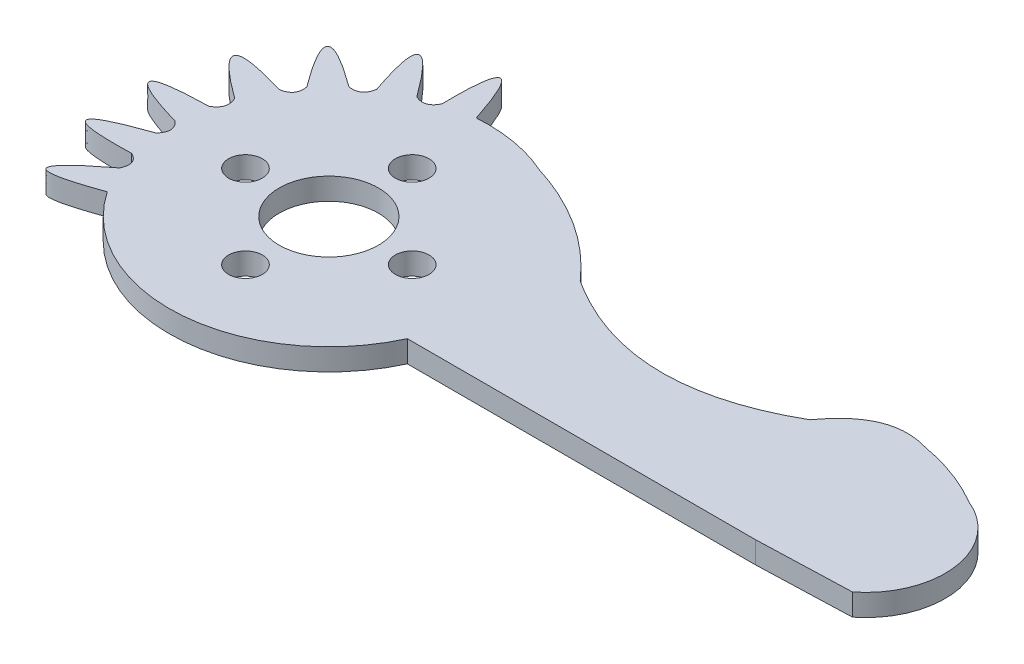
ISO-10303-21;
HEADER;
FILE_DESCRIPTION(('STEP AP214'),'2;1');
FILE_NAME('part.step','',(''),(''),'','','');
FILE_SCHEMA(('AUTOMOTIVE_DESIGN { 1 0 10303 214 1 1 1 1 }'));
ENDSEC;
DATA;
#1=APPLICATION_CONTEXT('core data for automotive mechanical design processes');
#2=APPLICATION_PROTOCOL_DEFINITION('international standard','automotive_design',2000,#1);
#3=PRODUCT_CONTEXT('',#1,'mechanical');
#4=PRODUCT('Part','Part','',(#3));
#5=PRODUCT_RELATED_PRODUCT_CATEGORY('part','',(#4));
#6=PRODUCT_DEFINITION_FORMATION('','',#4);
#7=PRODUCT_DEFINITION_CONTEXT('part definition',#1,'design');
#8=PRODUCT_DEFINITION('design','',#6,#7);
#9=PRODUCT_DEFINITION_SHAPE('','',#8);
#10=(LENGTH_UNIT() NAMED_UNIT(*) SI_UNIT(.MILLI.,.METRE.));
#11=(NAMED_UNIT(*) PLANE_ANGLE_UNIT() SI_UNIT($,.RADIAN.));
#12=(NAMED_UNIT(*) SI_UNIT($,.STERADIAN.) SOLID_ANGLE_UNIT());
#13=UNCERTAINTY_MEASURE_WITH_UNIT(LENGTH_MEASURE(1.E-05),#10,'distance_accuracy_value','');
#14=(GEOMETRIC_REPRESENTATION_CONTEXT(3) GLOBAL_UNCERTAINTY_ASSIGNED_CONTEXT((#13)) GLOBAL_UNIT_ASSIGNED_CONTEXT((#10,
#11,#12)) REPRESENTATION_CONTEXT('',''));
#15=CARTESIAN_POINT('',(0.,0.,0.));
#16=DIRECTION('',(0.,0.,1.));
#17=DIRECTION('',(1.,0.,0.));
#18=AXIS2_PLACEMENT_3D('',#15,#16,#17);
#19=CARTESIAN_POINT('',(0.,2.2,0.));
#20=DIRECTION('',(0.,1.,0.));
#21=DIRECTION('',(0.,0.,1.));
#22=AXIS2_PLACEMENT_3D('',#19,#20,#21);
#23=PLANE('',#22);
#24=CARTESIAN_POINT('',(-8.4,2.2,0.));
#25=DIRECTION('',(0.,1.,0.));
#26=DIRECTION('',(0.,0.,1.));
#27=AXIS2_PLACEMENT_3D('',#24,#25,#26);
#28=CIRCLE('',#27,1.7);
#29=CARTESIAN_POINT('',(-8.4,2.2,1.7));
#30=VERTEX_POINT('',#29);
#31=EDGE_CURVE('E449',#30,#30,#28,.T.);
#32=ORIENTED_EDGE('',*,*,#31,.F.);
#33=EDGE_LOOP('',(#32));
#34=FACE_BOUND('',#33,.T.);
#35=CARTESIAN_POINT('',(0.,2.2,-8.4));
#36=DIRECTION('',(0.,1.,0.));
#37=DIRECTION('',(0.,0.,1.));
#38=AXIS2_PLACEMENT_3D('',#35,#36,#37);
#39=CIRCLE('',#38,1.7);
#40=CARTESIAN_POINT('',(0.,2.2,-6.7));
#41=VERTEX_POINT('',#40);
#42=EDGE_CURVE('E432',#41,#41,#39,.T.);
#43=ORIENTED_EDGE('',*,*,#42,.F.);
#44=EDGE_LOOP('',(#43));
#45=FACE_BOUND('',#44,.T.);
#46=CARTESIAN_POINT('',(0.,2.2,0.));
#47=DIRECTION('',(0.,1.,0.));
#48=DIRECTION('',(0.,0.,1.));
#49=AXIS2_PLACEMENT_3D('',#46,#47,#48);
#50=CIRCLE('',#49,16.0739677070553);
#51=CARTESIAN_POINT('',(-13.3181244117727,2.2,9.));
#52=VERTEX_POINT('',#51);
#53=CARTESIAN_POINT('',(14.6110382193551,2.2,6.7));
#54=VERTEX_POINT('',#53);
#55=EDGE_CURVE('E424',#52,#54,#50,.T.);
#56=ORIENTED_EDGE('',*,*,#55,.T.);
#57=DIRECTION('',(1.,0.,0.));
#58=VECTOR('',#57,1.);
#59=CARTESIAN_POINT('',(14.6110382193551,2.2,6.7));
#60=LINE('',#59,#58);
#61=CARTESIAN_POINT('',(49.6904432139309,2.2,6.7));
#62=VERTEX_POINT('',#61);
#63=EDGE_CURVE('E146',#54,#62,#60,.T.);
#64=ORIENTED_EDGE('',*,*,#63,.T.);
#65=DIRECTION('',(0.999414604685837,0.,-0.0342118099587287));
#66=VECTOR('',#65,1.);
#67=CARTESIAN_POINT('',(49.6904432139309,2.2,6.7));
#68=LINE('',#67,#66);
#69=CARTESIAN_POINT('',(59.1421347100975,2.2,6.37645112274797));
#70=VERTEX_POINT('',#69);
#71=EDGE_CURVE('E419',#62,#70,#68,.T.);
#72=ORIENTED_EDGE('',*,*,#71,.T.);
#73=CARTESIAN_POINT('',(54.1955227979198,2.2,0.08908040119025));
#74=DIRECTION('',(0.,1.,0.));
#75=DIRECTION('',(0.,0.,1.));
#76=AXIS2_PLACEMENT_3D('',#73,#74,#75);
#77=CIRCLE('',#76,8.);
#78=CARTESIAN_POINT('',(57.1955227979198,2.2,-7.32711808590541));
#79=VERTEX_POINT('',#78);
#80=EDGE_CURVE('E413',#70,#79,#77,.T.);
#81=ORIENTED_EDGE('',*,*,#80,.T.);
#82=CARTESIAN_POINT('',(57.1955227979198,2.2,-7.32711808590541));
#83=CARTESIAN_POINT('',(55.0441661515011,2.2,-8.59284596352753));
#84=CARTESIAN_POINT('',(52.7613610635912,2.2,-9.44385982918825));
#85=CARTESIAN_POINT('',(50.3471075342058,2.2,-9.88015968288478));
#86=B_SPLINE_CURVE_WITH_KNOTS('',3,(#82,#83,#84,#85),.UNSPECIFIED.,.F.,.F.,(4,4),
(0.288436631386398,1.),.UNSPECIFIED.);
#87=CARTESIAN_POINT('',(50.3471075342058,2.2,-9.88015968288478));
#88=VERTEX_POINT('',#87);
#89=EDGE_CURVE('E405',#79,#88,#86,.T.);
#90=ORIENTED_EDGE('',*,*,#89,.T.);
#91=CARTESIAN_POINT('',(50.3471075342058,2.2,-9.88015968288478));
#92=CARTESIAN_POINT('',(49.3037046635884,2.2,-10.1960733015901));
#93=CARTESIAN_POINT('',(46.3170816729696,2.2,-10.5567937203678));
#94=CARTESIAN_POINT('',(43.6670457923112,2.2,-8.84896027063307));
#95=CARTESIAN_POINT('',(41.9843605931134,2.2,-6.51415198749853));
#96=B_SPLINE_CURVE_WITH_KNOTS('',3,(#91,#92,#93,#94,#95),.UNSPECIFIED.,.F.,.F.,(4,1,4),
(0.0900850462791173,0.305835094832972,0.736118781976558),.UNSPECIFIED.);
#97=CARTESIAN_POINT('',(41.9843605931134,2.2,-6.51415198749853));
#98=VERTEX_POINT('',#97);
#99=EDGE_CURVE('E400',#88,#98,#96,.T.);
#100=ORIENTED_EDGE('',*,*,#99,.T.);
#101=CARTESIAN_POINT('',(41.9843605931134,2.2,-6.51415198749853));
#102=CARTESIAN_POINT('',(29.823970963395,2.2,0.449921725729593));
#103=CARTESIAN_POINT('',(18.2939540597451,2.2,-7.03712532677834));
#104=B_SPLINE_CURVE_WITH_KNOTS('',2,(#101,#102,#103),.UNSPECIFIED.,.F.,.F.,(3,3),(0.,1.),.UNSPECIFIED.);
#105=CARTESIAN_POINT('',(18.2939540597451,2.2,-7.03712532677834));
#106=VERTEX_POINT('',#105);
#107=EDGE_CURVE('E375',#98,#106,#104,.T.);
#108=ORIENTED_EDGE('',*,*,#107,.T.);
#109=CARTESIAN_POINT('',(18.2939540597451,2.2,-7.03712532677834));
#110=CARTESIAN_POINT('',(13.5089534166022,2.2,-12.4928165220149));
#111=CARTESIAN_POINT('',(6.55512816257974,2.2,-14.6766049418662));
#112=B_SPLINE_CURVE_WITH_KNOTS('',2,(#109,#110,#111),.UNSPECIFIED.,.F.,.F.,(3,3),(0.,1.),.UNSPECIFIED.);
#113=CARTESIAN_POINT('',(6.55512816257974,2.2,-14.6766049418662));
#114=VERTEX_POINT('',#113);
#115=EDGE_CURVE('E369',#106,#114,#112,.T.);
#116=ORIENTED_EDGE('',*,*,#115,.T.);
#117=CARTESIAN_POINT('',(0.,2.2,0.));
#118=DIRECTION('',(0.,1.,0.));
#119=DIRECTION('',(0.,0.,1.));
#120=AXIS2_PLACEMENT_3D('',#117,#118,#119);
#121=CIRCLE('',#120,16.0739677070553);
#122=CARTESIAN_POINT('',(-1.17402328634825,2.2,-16.0310357485275));
#123=VERTEX_POINT('',#122);
#124=EDGE_CURVE('E363',#114,#123,#121,.T.);
#125=ORIENTED_EDGE('',*,*,#124,.T.);
#126=CARTESIAN_POINT('',(-1.17402328634825,2.2,-16.0310357485275));
#127=CARTESIAN_POINT('',(-4.31115929351365,2.2,-25.6439633812806));
#128=CARTESIAN_POINT('',(-4.13250681705568,2.2,-15.533667475984));
#129=B_SPLINE_CURVE_WITH_KNOTS('',2,(#126,#127,#128),.UNSPECIFIED.,.F.,.F.,(3,3),(0.,1.),.UNSPECIFIED.);
#130=CARTESIAN_POINT('',(-4.13250681705568,2.2,-15.533667475984));
#131=VERTEX_POINT('',#130);
#132=EDGE_CURVE('E354',#123,#131,#129,.T.);
#133=ORIENTED_EDGE('',*,*,#132,.T.);
#134=CARTESIAN_POINT('',(-4.13250681705568,2.2,-15.533667475984));
#135=CARTESIAN_POINT('',(-4.764310753869,2.2,-14.2684308240382));
#136=CARTESIAN_POINT('',(-6.02954740581487,2.2,-14.9002347608515));
#137=B_SPLINE_CURVE_WITH_KNOTS('',2,(#134,#135,#136),.UNSPECIFIED.,.F.,.F.,(3,3),(0.,1.),.UNSPECIFIED.);
#138=CARTESIAN_POINT('',(-6.02954740581487,2.2,-14.9002347608515));
#139=VERTEX_POINT('',#138);
#140=EDGE_CURVE('E349',#131,#139,#137,.T.);
#141=ORIENTED_EDGE('',*,*,#140,.T.);
#142=CARTESIAN_POINT('',(-6.02954740581487,2.2,-14.9002347608515));
#143=CARTESIAN_POINT('',(-11.9612421792253,2.2,-23.0895569009981));
#144=CARTESIAN_POINT('',(-8.69333508977325,2.2,-13.5202944814221));
#145=B_SPLINE_CURVE_WITH_KNOTS('',2,(#142,#143,#144),.UNSPECIFIED.,.F.,.F.,(3,3),(0.,1.),.UNSPECIFIED.);
#146=CARTESIAN_POINT('',(-8.69333508977325,2.2,-13.5202944814221));
#147=VERTEX_POINT('',#146);
#148=EDGE_CURVE('E326',#139,#147,#145,.T.);
#149=ORIENTED_EDGE('',*,*,#148,.T.);
#150=CARTESIAN_POINT('',(-8.69333508977325,2.2,-13.5202944814221));
#151=CARTESIAN_POINT('',(-8.90707486155735,2.2,-12.1223262021119));
#152=CARTESIAN_POINT('',(-10.3050431408676,2.2,-12.336065973896));
#153=B_SPLINE_CURVE_WITH_KNOTS('',2,(#150,#151,#152),.UNSPECIFIED.,.F.,.F.,(3,3),(0.,1.),.UNSPECIFIED.);
#154=CARTESIAN_POINT('',(-10.3050431408676,2.2,-12.336065973896));
#155=VERTEX_POINT('',#154);
#156=EDGE_CURVE('E317',#147,#155,#153,.T.);
#157=ORIENTED_EDGE('',*,*,#156,.T.);
#158=CARTESIAN_POINT('',(-10.3050431408676,2.2,-12.336065973896));
#159=CARTESIAN_POINT('',(-18.4606814909088,2.2,-18.3139889495905));
#160=CARTESIAN_POINT('',(-12.4178848215133,2.2,-10.2063007209804));
#161=B_SPLINE_CURVE_WITH_KNOTS('',2,(#158,#159,#160),.UNSPECIFIED.,.F.,.F.,(3,3),(0.,1.),.UNSPECIFIED.);
#162=CARTESIAN_POINT('',(-12.4178848215133,2.2,-10.2063007209804));
#163=VERTEX_POINT('',#162);
#164=EDGE_CURVE('E308',#155,#163,#161,.T.);
#165=ORIENTED_EDGE('',*,*,#164,.T.);
#166=CARTESIAN_POINT('',(-12.4178848215133,2.2,-10.2063007209804));
#167=CARTESIAN_POINT('',(-12.1929991611997,2.2,-8.81008209920758));
#168=CARTESIAN_POINT('',(-13.5892177829726,2.2,-8.58519643889399));
#169=B_SPLINE_CURVE_WITH_KNOTS('',2,(#166,#167,#168),.UNSPECIFIED.,.F.,.F.,(3,3),(0.,1.),.UNSPECIFIED.);
#170=CARTESIAN_POINT('',(-13.5892177829726,2.2,-8.58519643889399));
#171=VERTEX_POINT('',#170);
#172=EDGE_CURVE('E303',#163,#171,#169,.T.);
#173=ORIENTED_EDGE('',*,*,#172,.T.);
#174=CARTESIAN_POINT('',(-13.5892177829726,2.2,-8.58519643889399));
#175=CARTESIAN_POINT('',(-23.2950739914482,2.2,-11.5171465993588));
#176=CARTESIAN_POINT('',(-15.0724257698096,2.2,-5.58519643889399));
#177=B_SPLINE_CURVE_WITH_KNOTS('',2,(#174,#175,#176),.UNSPECIFIED.,.F.,.F.,(3,3),(0.,1.),.UNSPECIFIED.);
#178=CARTESIAN_POINT('',(-15.0724257698096,2.2,-5.58519643889399));
#179=VERTEX_POINT('',#178);
#180=EDGE_CURVE('E280',#171,#179,#177,.T.);
#181=ORIENTED_EDGE('',*,*,#180,.T.);
#182=CARTESIAN_POINT('',(-15.0724257698096,2.2,-5.58519643889399));
#183=CARTESIAN_POINT('',(-14.4124610618603,2.2,-4.2993373399729));
#184=CARTESIAN_POINT('',(-15.6690396751683,2.2,-3.58519643889399));
#185=B_SPLINE_CURVE_WITH_KNOTS('',2,(#182,#183,#184),.UNSPECIFIED.,.F.,.F.,(3,3),(0.,1.),.UNSPECIFIED.);
#186=CARTESIAN_POINT('',(-15.6690396751683,2.2,-3.58519643889399));
#187=VERTEX_POINT('',#186);
#188=EDGE_CURVE('E271',#179,#187,#185,.T.);
#189=ORIENTED_EDGE('',*,*,#188,.T.);
#190=CARTESIAN_POINT('',(-15.6690396751683,2.2,-3.58519643889399));
#191=CARTESIAN_POINT('',(-25.7809172176548,2.2,-3.38823153237769));
#192=CARTESIAN_POINT('',(-16.06331170635,2.2,-0.585196438893989));
#193=B_SPLINE_CURVE_WITH_KNOTS('',2,(#190,#191,#192),.UNSPECIFIED.,.F.,.F.,(3,3),(0.,1.),.UNSPECIFIED.);
#194=CARTESIAN_POINT('',(-16.06331170635,2.2,-0.585196438893989));
#195=VERTEX_POINT('',#194);
#196=EDGE_CURVE('E262',#187,#195,#193,.T.);
#197=ORIENTED_EDGE('',*,*,#196,.T.);
#198=CARTESIAN_POINT('',(-16.06331170635,2.2,-0.585196438893989));
#199=CARTESIAN_POINT('',(-15.0378750753459,2.2,0.394118454941576));
#200=CARTESIAN_POINT('',(-16.0115823306423,2.2,1.41480356110601));
#201=B_SPLINE_CURVE_WITH_KNOTS('',2,(#198,#199,#200),.UNSPECIFIED.,.F.,.F.,(3,3),(0.,1.),.UNSPECIFIED.);
#202=CARTESIAN_POINT('',(-16.0115823306423,2.2,1.41480356110601));
#203=VERTEX_POINT('',#202);
#204=EDGE_CURVE('E207',#195,#203,#201,.T.);
#205=ORIENTED_EDGE('',*,*,#204,.T.);
#206=CARTESIAN_POINT('',(-16.0115823306423,2.2,1.41480356110601));
#207=CARTESIAN_POINT('',(-25.566384922753,2.2,4.7363949242953));
#208=CARTESIAN_POINT('',(-15.4558062670409,2.2,4.41480356110602));
#209=B_SPLINE_CURVE_WITH_KNOTS('',2,(#206,#207,#208),.UNSPECIFIED.,.F.,.F.,(3,3),(0.,1.),.UNSPECIFIED.);
#210=CARTESIAN_POINT('',(-15.4558062670409,2.2,4.41480356110602));
#211=VERTEX_POINT('',#210);
#212=EDGE_CURVE('E201',#203,#211,#209,.T.);
#213=ORIENTED_EDGE('',*,*,#212,.T.);
#214=CARTESIAN_POINT('',(-15.4558062670409,2.2,4.41480356110602));
#215=CARTESIAN_POINT('',(-14.1792697764444,2.2,5.02345336861065));
#216=CARTESIAN_POINT('',(-14.787919583949,2.2,6.2999898592072));
#217=B_SPLINE_CURVE_WITH_KNOTS('',2,(#214,#215,#216),.UNSPECIFIED.,.F.,.F.,(3,3),(0.,1.),.UNSPECIFIED.);
#218=CARTESIAN_POINT('',(-14.787919583949,2.2,6.2999898592072));
#219=VERTEX_POINT('',#218);
#220=EDGE_CURVE('E205',#211,#219,#217,.T.);
#221=ORIENTED_EDGE('',*,*,#220,.T.);
#222=CARTESIAN_POINT('',(-14.787919583949,2.2,6.2999898592072));
#223=CARTESIAN_POINT('',(-22.8359917841327,2.2,12.4311497831339));
#224=CARTESIAN_POINT('',(-13.3181244117727,2.2,9.));
#225=B_SPLINE_CURVE_WITH_KNOTS('',2,(#222,#223,#224),.UNSPECIFIED.,.F.,.F.,(3,3),(0.,1.),.UNSPECIFIED.);
#226=EDGE_CURVE('E61',#219,#52,#225,.T.);
#227=ORIENTED_EDGE('',*,*,#226,.T.);
#228=EDGE_LOOP('',(#56,#64,#72,#81,#90,#100,#108,#116,#125,#133,#141,#149,#157,#165,#173,#181,
#189,#197,#205,#213,#221,#227));
#229=FACE_BOUND('',#228,.T.);
#230=CARTESIAN_POINT('',(0.,2.2,0.));
#231=DIRECTION('',(0.,1.,0.));
#232=DIRECTION('',(0.,0.,1.));
#233=AXIS2_PLACEMENT_3D('',#230,#231,#232);
#234=CIRCLE('',#233,5.);
#235=CARTESIAN_POINT('',(0.,2.2,5.));
#236=VERTEX_POINT('',#235);
#237=EDGE_CURVE('E431',#236,#236,#234,.T.);
#238=ORIENTED_EDGE('',*,*,#237,.F.);
#239=EDGE_LOOP('',(#238));
#240=FACE_BOUND('',#239,.T.);
#241=CARTESIAN_POINT('',(8.4,2.2,0.));
#242=DIRECTION('',(0.,1.,0.));
#243=DIRECTION('',(0.,0.,1.));
#244=AXIS2_PLACEMENT_3D('',#241,#242,#243);
#245=CIRCLE('',#244,1.7);
#246=CARTESIAN_POINT('',(8.4,2.2,1.7));
#247=VERTEX_POINT('',#246);
#248=EDGE_CURVE('E441',#247,#247,#245,.T.);
#249=ORIENTED_EDGE('',*,*,#248,.F.);
#250=EDGE_LOOP('',(#249));
#251=FACE_BOUND('',#250,.T.);
#252=CARTESIAN_POINT('',(0.,2.2,8.4));
#253=DIRECTION('',(0.,1.,0.));
#254=DIRECTION('',(0.,0.,1.));
#255=AXIS2_PLACEMENT_3D('',#252,#253,#254);
#256=CIRCLE('',#255,1.7);
#257=CARTESIAN_POINT('',(0.,2.2,10.1));
#258=VERTEX_POINT('',#257);
#259=EDGE_CURVE('E457',#258,#258,#256,.T.);
#260=ORIENTED_EDGE('',*,*,#259,.F.);
#261=EDGE_LOOP('',(#260));
#262=FACE_BOUND('',#261,.T.);
#263=ADVANCED_FACE('F43',(#34,#45,#229,#240,#251,#262),#23,.T.);
#264=CARTESIAN_POINT('',(0.,0.,0.));
#265=DIRECTION('',(0.,1.,0.));
#266=DIRECTION('',(0.,0.,1.));
#267=AXIS2_PLACEMENT_3D('',#264,#265,#266);
#268=PLANE('',#267);
#269=CARTESIAN_POINT('',(0.,0.,0.));
#270=DIRECTION('',(0.,1.,0.));
#271=DIRECTION('',(0.,0.,1.));
#272=AXIS2_PLACEMENT_3D('',#269,#270,#271);
#273=CIRCLE('',#272,16.0739677070553);
#274=CARTESIAN_POINT('',(-13.3181244117727,0.,9.));
#275=VERTEX_POINT('',#274);
#276=CARTESIAN_POINT('',(14.6110382193551,0.,6.7));
#277=VERTEX_POINT('',#276);
#278=EDGE_CURVE('E436',#275,#277,#273,.T.);
#279=ORIENTED_EDGE('',*,*,#278,.F.);
#280=CARTESIAN_POINT('',(-14.787919583949,0.,6.2999898592072));
#281=CARTESIAN_POINT('',(-22.8359917841327,0.,12.4311497831339));
#282=CARTESIAN_POINT('',(-13.3181244117727,0.,9.));
#283=B_SPLINE_CURVE_WITH_KNOTS('',2,(#280,#281,#282),.UNSPECIFIED.,.F.,.F.,(3,3),(0.,1.),.UNSPECIFIED.);
#284=CARTESIAN_POINT('',(-14.787919583949,0.,6.2999898592072));
#285=VERTEX_POINT('',#284);
#286=EDGE_CURVE('E138',#285,#275,#283,.T.);
#287=ORIENTED_EDGE('',*,*,#286,.F.);
#288=CARTESIAN_POINT('',(-15.4558062670409,0.,4.41480356110602));
#289=CARTESIAN_POINT('',(-14.1792697764444,0.,5.02345336861065));
#290=CARTESIAN_POINT('',(-14.787919583949,0.,6.2999898592072));
#291=B_SPLINE_CURVE_WITH_KNOTS('',2,(#288,#289,#290),.UNSPECIFIED.,.F.,.F.,(3,3),(0.,1.),.UNSPECIFIED.);
#292=CARTESIAN_POINT('',(-15.4558062670409,0.,4.41480356110602));
#293=VERTEX_POINT('',#292);
#294=EDGE_CURVE('E132',#293,#285,#291,.T.);
#295=ORIENTED_EDGE('',*,*,#294,.F.);
#296=CARTESIAN_POINT('',(-16.0115823306423,0.,1.41480356110601));
#297=CARTESIAN_POINT('',(-25.566384922753,0.,4.7363949242953));
#298=CARTESIAN_POINT('',(-15.4558062670409,0.,4.41480356110602));
#299=B_SPLINE_CURVE_WITH_KNOTS('',2,(#296,#297,#298),.UNSPECIFIED.,.F.,.F.,(3,3),(0.,1.),.UNSPECIFIED.);
#300=CARTESIAN_POINT('',(-16.0115823306423,0.,1.41480356110601));
#301=VERTEX_POINT('',#300);
#302=EDGE_CURVE('E216',#301,#293,#299,.T.);
#303=ORIENTED_EDGE('',*,*,#302,.F.);
#304=CARTESIAN_POINT('',(-16.06331170635,0.,-0.585196438893989));
#305=CARTESIAN_POINT('',(-15.0378750753459,0.,0.394118454941576));
#306=CARTESIAN_POINT('',(-16.0115823306423,0.,1.41480356110601));
#307=B_SPLINE_CURVE_WITH_KNOTS('',2,(#304,#305,#306),.UNSPECIFIED.,.F.,.F.,(3,3),(0.,1.),.UNSPECIFIED.);
#308=CARTESIAN_POINT('',(-16.06331170635,0.,-0.585196438893989));
#309=VERTEX_POINT('',#308);
#310=EDGE_CURVE('E900',#309,#301,#307,.T.);
#311=ORIENTED_EDGE('',*,*,#310,.F.);
#312=CARTESIAN_POINT('',(-15.6690396751683,0.,-3.58519643889399));
#313=CARTESIAN_POINT('',(-25.7809172176548,0.,-3.38823153237769));
#314=CARTESIAN_POINT('',(-16.06331170635,0.,-0.585196438893989));
#315=B_SPLINE_CURVE_WITH_KNOTS('',2,(#312,#313,#314),.UNSPECIFIED.,.F.,.F.,(3,3),(0.,1.),.UNSPECIFIED.);
#316=CARTESIAN_POINT('',(-15.6690396751683,0.,-3.58519643889399));
#317=VERTEX_POINT('',#316);
#318=EDGE_CURVE('E892',#317,#309,#315,.T.);
#319=ORIENTED_EDGE('',*,*,#318,.F.);
#320=CARTESIAN_POINT('',(-15.0724257698096,0.,-5.58519643889399));
#321=CARTESIAN_POINT('',(-14.4124610618603,0.,-4.2993373399729));
#322=CARTESIAN_POINT('',(-15.6690396751683,0.,-3.58519643889399));
#323=B_SPLINE_CURVE_WITH_KNOTS('',2,(#320,#321,#322),.UNSPECIFIED.,.F.,.F.,(3,3),(0.,1.),.UNSPECIFIED.);
#324=CARTESIAN_POINT('',(-15.0724257698096,0.,-5.58519643889399));
#325=VERTEX_POINT('',#324);
#326=EDGE_CURVE('E884',#325,#317,#323,.T.);
#327=ORIENTED_EDGE('',*,*,#326,.F.);
#328=CARTESIAN_POINT('',(-13.5892177829726,0.,-8.58519643889399));
#329=CARTESIAN_POINT('',(-23.2950739914482,0.,-11.5171465993588));
#330=CARTESIAN_POINT('',(-15.0724257698096,0.,-5.58519643889399));
#331=B_SPLINE_CURVE_WITH_KNOTS('',2,(#328,#329,#330),.UNSPECIFIED.,.F.,.F.,(3,3),(0.,1.),.UNSPECIFIED.);
#332=CARTESIAN_POINT('',(-13.5892177829726,0.,-8.58519643889399));
#333=VERTEX_POINT('',#332);
#334=EDGE_CURVE('E876',#333,#325,#331,.T.);
#335=ORIENTED_EDGE('',*,*,#334,.F.);
#336=CARTESIAN_POINT('',(-12.4178848215133,0.,-10.2063007209804));
#337=CARTESIAN_POINT('',(-12.1929991611997,0.,-8.81008209920758));
#338=CARTESIAN_POINT('',(-13.5892177829726,0.,-8.58519643889399));
#339=B_SPLINE_CURVE_WITH_KNOTS('',2,(#336,#337,#338),.UNSPECIFIED.,.F.,.F.,(3,3),(0.,1.),.UNSPECIFIED.);
#340=CARTESIAN_POINT('',(-12.4178848215133,0.,-10.2063007209804));
#341=VERTEX_POINT('',#340);
#342=EDGE_CURVE('E868',#341,#333,#339,.T.);
#343=ORIENTED_EDGE('',*,*,#342,.F.);
#344=CARTESIAN_POINT('',(-10.3050431408676,0.,-12.336065973896));
#345=CARTESIAN_POINT('',(-18.4606814909088,0.,-18.3139889495905));
#346=CARTESIAN_POINT('',(-12.4178848215133,0.,-10.2063007209804));
#347=B_SPLINE_CURVE_WITH_KNOTS('',2,(#344,#345,#346),.UNSPECIFIED.,.F.,.F.,(3,3),(0.,1.),.UNSPECIFIED.);
#348=CARTESIAN_POINT('',(-10.3050431408676,0.,-12.336065973896));
#349=VERTEX_POINT('',#348);
#350=EDGE_CURVE('E860',#349,#341,#347,.T.);
#351=ORIENTED_EDGE('',*,*,#350,.F.);
#352=CARTESIAN_POINT('',(-8.69333508977325,0.,-13.5202944814221));
#353=CARTESIAN_POINT('',(-8.90707486155735,0.,-12.1223262021119));
#354=CARTESIAN_POINT('',(-10.3050431408676,0.,-12.336065973896));
#355=B_SPLINE_CURVE_WITH_KNOTS('',2,(#352,#353,#354),.UNSPECIFIED.,.F.,.F.,(3,3),(0.,1.),.UNSPECIFIED.);
#356=CARTESIAN_POINT('',(-8.69333508977325,0.,-13.5202944814221));
#357=VERTEX_POINT('',#356);
#358=EDGE_CURVE('E853',#357,#349,#355,.T.);
#359=ORIENTED_EDGE('',*,*,#358,.F.);
#360=CARTESIAN_POINT('',(-6.02954740581487,0.,-14.9002347608515));
#361=CARTESIAN_POINT('',(-11.9612421792253,0.,-23.0895569009981));
#362=CARTESIAN_POINT('',(-8.69333508977325,0.,-13.5202944814221));
#363=B_SPLINE_CURVE_WITH_KNOTS('',2,(#360,#361,#362),.UNSPECIFIED.,.F.,.F.,(3,3),(0.,1.),.UNSPECIFIED.);
#364=CARTESIAN_POINT('',(-6.02954740581487,0.,-14.9002347608515));
#365=VERTEX_POINT('',#364);
#366=EDGE_CURVE('E845',#365,#357,#363,.T.);
#367=ORIENTED_EDGE('',*,*,#366,.F.);
#368=CARTESIAN_POINT('',(-4.13250681705568,0.,-15.533667475984));
#369=CARTESIAN_POINT('',(-4.764310753869,0.,-14.2684308240382));
#370=CARTESIAN_POINT('',(-6.02954740581487,0.,-14.9002347608515));
#371=B_SPLINE_CURVE_WITH_KNOTS('',2,(#368,#369,#370),.UNSPECIFIED.,.F.,.F.,(3,3),(0.,1.),.UNSPECIFIED.);
#372=CARTESIAN_POINT('',(-4.13250681705568,0.,-15.533667475984));
#373=VERTEX_POINT('',#372);
#374=EDGE_CURVE('E837',#373,#365,#371,.T.);
#375=ORIENTED_EDGE('',*,*,#374,.F.);
#376=CARTESIAN_POINT('',(-1.17402328634825,0.,-16.0310357485275));
#377=CARTESIAN_POINT('',(-4.31115929351365,0.,-25.6439633812806));
#378=CARTESIAN_POINT('',(-4.13250681705568,0.,-15.533667475984));
#379=B_SPLINE_CURVE_WITH_KNOTS('',2,(#376,#377,#378),.UNSPECIFIED.,.F.,.F.,(3,3),(0.,1.),.UNSPECIFIED.);
#380=CARTESIAN_POINT('',(-1.17402328634825,0.,-16.0310357485275));
#381=VERTEX_POINT('',#380);
#382=EDGE_CURVE('E832',#381,#373,#379,.T.);
#383=ORIENTED_EDGE('',*,*,#382,.F.);
#384=CARTESIAN_POINT('',(0.,0.,0.));
#385=DIRECTION('',(0.,1.,0.));
#386=DIRECTION('',(0.,0.,1.));
#387=AXIS2_PLACEMENT_3D('',#384,#385,#386);
#388=CIRCLE('',#387,16.0739677070553);
#389=CARTESIAN_POINT('',(6.55512816257974,0.,-14.6766049418662));
#390=VERTEX_POINT('',#389);
#391=EDGE_CURVE('E827',#390,#381,#388,.T.);
#392=ORIENTED_EDGE('',*,*,#391,.F.);
#393=CARTESIAN_POINT('',(18.2939540597451,0.,-7.03712532677834));
#394=CARTESIAN_POINT('',(13.5089534166022,0.,-12.4928165220149));
#395=CARTESIAN_POINT('',(6.55512816257974,0.,-14.6766049418662));
#396=B_SPLINE_CURVE_WITH_KNOTS('',2,(#393,#394,#395),.UNSPECIFIED.,.F.,.F.,(3,3),(0.,1.),.UNSPECIFIED.);
#397=CARTESIAN_POINT('',(18.2939540597451,0.,-7.03712532677834));
#398=VERTEX_POINT('',#397);
#399=EDGE_CURVE('E819',#398,#390,#396,.T.);
#400=ORIENTED_EDGE('',*,*,#399,.F.);
#401=CARTESIAN_POINT('',(41.9843605931134,0.,-6.51415198749853));
#402=CARTESIAN_POINT('',(29.823970963395,0.,0.449921725729593));
#403=CARTESIAN_POINT('',(18.2939540597451,0.,-7.03712532677834));
#404=B_SPLINE_CURVE_WITH_KNOTS('',2,(#401,#402,#403),.UNSPECIFIED.,.F.,.F.,(3,3),(0.,1.),.UNSPECIFIED.);
#405=CARTESIAN_POINT('',(41.9843605931134,0.,-6.51415198749853));
#406=VERTEX_POINT('',#405);
#407=EDGE_CURVE('E811',#406,#398,#404,.T.);
#408=ORIENTED_EDGE('',*,*,#407,.F.);
#409=CARTESIAN_POINT('',(50.3471075342058,0.,-9.88015968288478));
#410=CARTESIAN_POINT('',(49.3037046635884,0.,-10.1960733015901));
#411=CARTESIAN_POINT('',(46.3170816729696,0.,-10.5567937203678));
#412=CARTESIAN_POINT('',(43.6670457923112,0.,-8.84896027063307));
#413=CARTESIAN_POINT('',(41.9843605931134,0.,-6.51415198749853));
#414=B_SPLINE_CURVE_WITH_KNOTS('',3,(#409,#410,#411,#412,#413),.UNSPECIFIED.,.F.,.F.,(4,1,4),
(0.0900850462791173,0.305835094832972,0.736118781976558),.UNSPECIFIED.);
#415=CARTESIAN_POINT('',(50.3471075342058,0.,-9.88015968288478));
#416=VERTEX_POINT('',#415);
#417=EDGE_CURVE('E803',#416,#406,#414,.T.);
#418=ORIENTED_EDGE('',*,*,#417,.F.);
#419=CARTESIAN_POINT('',(57.1955227979198,0.,-7.32711808590541));
#420=CARTESIAN_POINT('',(55.0441661515011,0.,-8.59284596352753));
#421=CARTESIAN_POINT('',(52.7613610635912,0.,-9.44385982918825));
#422=CARTESIAN_POINT('',(50.3471075342058,0.,-9.88015968288478));
#423=B_SPLINE_CURVE_WITH_KNOTS('',3,(#419,#420,#421,#422),.UNSPECIFIED.,.F.,.F.,(4,4),
(0.288436631386398,1.),.UNSPECIFIED.);
#424=CARTESIAN_POINT('',(57.1955227979198,0.,-7.32711808590541));
#425=VERTEX_POINT('',#424);
#426=EDGE_CURVE('E798',#425,#416,#423,.T.);
#427=ORIENTED_EDGE('',*,*,#426,.F.);
#428=CARTESIAN_POINT('',(54.1955227979198,0.,0.08908040119025));
#429=DIRECTION('',(0.,1.,0.));
#430=DIRECTION('',(0.,0.,1.));
#431=AXIS2_PLACEMENT_3D('',#428,#429,#430);
#432=CIRCLE('',#431,8.);
#433=CARTESIAN_POINT('',(59.1421347100975,0.,6.37645112274797));
#434=VERTEX_POINT('',#433);
#435=EDGE_CURVE('E795',#434,#425,#432,.T.);
#436=ORIENTED_EDGE('',*,*,#435,.F.);
#437=DIRECTION('',(0.999414604685837,0.,-0.0342118099587287));
#438=VECTOR('',#437,1.);
#439=CARTESIAN_POINT('',(49.6904432139309,0.,6.7));
#440=LINE('',#439,#438);
#441=CARTESIAN_POINT('',(49.6904432139309,0.,6.7));
#442=VERTEX_POINT('',#441);
#443=EDGE_CURVE('E790',#442,#434,#440,.T.);
#444=ORIENTED_EDGE('',*,*,#443,.F.);
#445=DIRECTION('',(1.,0.,0.));
#446=VECTOR('',#445,1.);
#447=CARTESIAN_POINT('',(14.6110382193551,0.,6.7));
#448=LINE('',#447,#446);
#449=EDGE_CURVE('E787',#277,#442,#448,.T.);
#450=ORIENTED_EDGE('',*,*,#449,.F.);
#451=EDGE_LOOP('',(#279,#287,#295,#303,#311,#319,#327,#335,#343,#351,#359,#367,#375,#383,#392,
#400,#408,#418,#427,#436,#444,#450));
#452=FACE_BOUND('',#451,.T.);
#453=CARTESIAN_POINT('',(0.,0.,0.));
#454=DIRECTION('',(0.,1.,0.));
#455=DIRECTION('',(0.,0.,1.));
#456=AXIS2_PLACEMENT_3D('',#453,#454,#455);
#457=CIRCLE('',#456,5.);
#458=CARTESIAN_POINT('',(0.,0.,5.));
#459=VERTEX_POINT('',#458);
#460=EDGE_CURVE('E427',#459,#459,#457,.T.);
#461=ORIENTED_EDGE('',*,*,#460,.T.);
#462=EDGE_LOOP('',(#461));
#463=FACE_BOUND('',#462,.T.);
#464=CARTESIAN_POINT('',(0.,0.,-8.4));
#465=DIRECTION('',(0.,1.,0.));
#466=DIRECTION('',(0.,0.,1.));
#467=AXIS2_PLACEMENT_3D('',#464,#465,#466);
#468=CIRCLE('',#467,1.7);
#469=CARTESIAN_POINT('',(0.,0.,-6.7));
#470=VERTEX_POINT('',#469);
#471=EDGE_CURVE('E437',#470,#470,#468,.T.);
#472=ORIENTED_EDGE('',*,*,#471,.T.);
#473=EDGE_LOOP('',(#472));
#474=FACE_BOUND('',#473,.T.);
#475=CARTESIAN_POINT('',(8.4,0.,0.));
#476=DIRECTION('',(0.,1.,0.));
#477=DIRECTION('',(0.,0.,1.));
#478=AXIS2_PLACEMENT_3D('',#475,#476,#477);
#479=CIRCLE('',#478,1.7);
#480=CARTESIAN_POINT('',(8.4,0.,1.7));
#481=VERTEX_POINT('',#480);
#482=EDGE_CURVE('E445',#481,#481,#479,.T.);
#483=ORIENTED_EDGE('',*,*,#482,.T.);
#484=EDGE_LOOP('',(#483));
#485=FACE_BOUND('',#484,.T.);
#486=CARTESIAN_POINT('',(-8.4,0.,0.));
#487=DIRECTION('',(0.,1.,0.));
#488=DIRECTION('',(0.,0.,1.));
#489=AXIS2_PLACEMENT_3D('',#486,#487,#488);
#490=CIRCLE('',#489,1.7);
#491=CARTESIAN_POINT('',(-8.4,0.,1.7));
#492=VERTEX_POINT('',#491);
#493=EDGE_CURVE('E453',#492,#492,#490,.T.);
#494=ORIENTED_EDGE('',*,*,#493,.T.);
#495=EDGE_LOOP('',(#494));
#496=FACE_BOUND('',#495,.T.);
#497=CARTESIAN_POINT('',(0.,0.,8.4));
#498=DIRECTION('',(0.,1.,0.));
#499=DIRECTION('',(0.,0.,1.));
#500=AXIS2_PLACEMENT_3D('',#497,#498,#499);
#501=CIRCLE('',#500,1.7);
#502=CARTESIAN_POINT('',(0.,0.,10.1));
#503=VERTEX_POINT('',#502);
#504=EDGE_CURVE('E461',#503,#503,#501,.T.);
#505=ORIENTED_EDGE('',*,*,#504,.T.);
#506=EDGE_LOOP('',(#505));
#507=FACE_BOUND('',#506,.T.);
#508=ADVANCED_FACE('F474',(#452,#463,#474,#485,#496,#507),#268,.F.);
#509=CARTESIAN_POINT('',(0.,2.2,0.));
#510=DIRECTION('',(0.,-1.,0.));
#511=DIRECTION('',(0.,0.,-1.));
#512=AXIS2_PLACEMENT_3D('',#509,#510,#511);
#513=CYLINDRICAL_SURFACE('',#512,16.0739677070553);
#514=ORIENTED_EDGE('',*,*,#278,.T.);
#515=DIRECTION('',(0.,-1.,0.));
#516=VECTOR('',#515,1.);
#517=CARTESIAN_POINT('',(14.6110382193551,2.2,6.7));
#518=LINE('',#517,#516);
#519=EDGE_CURVE('E11',#54,#277,#518,.T.);
#520=ORIENTED_EDGE('',*,*,#519,.F.);
#521=ORIENTED_EDGE('',*,*,#55,.F.);
#522=DIRECTION('',(0.,-1.,0.));
#523=VECTOR('',#522,1.);
#524=CARTESIAN_POINT('',(-13.3181244117727,2.2,9.));
#525=LINE('',#524,#523);
#526=EDGE_CURVE('E227',#52,#275,#525,.T.);
#527=ORIENTED_EDGE('',*,*,#526,.T.);
#528=EDGE_LOOP('',(#514,#520,#521,#527));
#529=FACE_BOUND('',#528,.T.);
#530=ADVANCED_FACE('F45',(#529),#513,.T.);
#531=CARTESIAN_POINT('',(14.6110382193551,2.2,6.7));
#532=DIRECTION('',(0.,0.,-1.));
#533=DIRECTION('',(-1.,0.,0.));
#534=AXIS2_PLACEMENT_3D('',#531,#532,#533);
#535=PLANE('',#534);
#536=ORIENTED_EDGE('',*,*,#449,.T.);
#537=DIRECTION('',(0.,-1.,0.));
#538=VECTOR('',#537,1.);
#539=CARTESIAN_POINT('',(49.6904432139309,2.2,6.7));
#540=LINE('',#539,#538);
#541=EDGE_CURVE('E53',#62,#442,#540,.T.);
#542=ORIENTED_EDGE('',*,*,#541,.F.);
#543=ORIENTED_EDGE('',*,*,#63,.F.);
#544=ORIENTED_EDGE('',*,*,#519,.T.);
#545=EDGE_LOOP('',(#536,#542,#543,#544));
#546=FACE_BOUND('',#545,.T.);
#547=ADVANCED_FACE('F592',(#546),#535,.F.);
#548=CARTESIAN_POINT('',(49.6904432139309,2.2,6.7));
#549=DIRECTION('',(-0.0342118099587287,0.,-0.999414604685837));
#550=DIRECTION('',(-0.999414604685837,0.,0.0342118099587287));
#551=AXIS2_PLACEMENT_3D('',#548,#549,#550);
#552=PLANE('',#551);
#553=ORIENTED_EDGE('',*,*,#443,.T.);
#554=DIRECTION('',(0.,-1.,0.));
#555=VECTOR('',#554,1.);
#556=CARTESIAN_POINT('',(59.1421347100975,2.2,6.37645112274797));
#557=LINE('',#556,#555);
#558=EDGE_CURVE('E998',#70,#434,#557,.T.);
#559=ORIENTED_EDGE('',*,*,#558,.F.);
#560=ORIENTED_EDGE('',*,*,#71,.F.);
#561=ORIENTED_EDGE('',*,*,#541,.T.);
#562=EDGE_LOOP('',(#553,#559,#560,#561));
#563=FACE_BOUND('',#562,.T.);
#564=ADVANCED_FACE('F586',(#563),#552,.F.);
#565=CARTESIAN_POINT('',(54.1955227979198,2.2,0.08908040119025));
#566=DIRECTION('',(0.,-1.,0.));
#567=DIRECTION('',(0.,0.,-1.));
#568=AXIS2_PLACEMENT_3D('',#565,#566,#567);
#569=CYLINDRICAL_SURFACE('',#568,8.);
#570=ORIENTED_EDGE('',*,*,#435,.T.);
#571=DIRECTION('',(0.,-1.,0.));
#572=VECTOR('',#571,1.);
#573=CARTESIAN_POINT('',(57.1955227979198,2.2,-7.32711808590541));
#574=LINE('',#573,#572);
#575=EDGE_CURVE('E994',#79,#425,#574,.T.);
#576=ORIENTED_EDGE('',*,*,#575,.F.);
#577=ORIENTED_EDGE('',*,*,#80,.F.);
#578=ORIENTED_EDGE('',*,*,#558,.T.);
#579=EDGE_LOOP('',(#570,#576,#577,#578));
#580=FACE_BOUND('',#579,.T.);
#581=ADVANCED_FACE('F580',(#580),#569,.T.);
#582=DIRECTION('',(0.,-1.,0.));
#583=VECTOR('',#582,1.);
#584=SURFACE_OF_LINEAR_EXTRUSION('',#86,#583);
#585=ORIENTED_EDGE('',*,*,#426,.T.);
#586=DIRECTION('',(0.,-1.,0.));
#587=VECTOR('',#586,1.);
#588=CARTESIAN_POINT('',(50.3471075342058,2.2,-9.88015968288478));
#589=LINE('',#588,#587);
#590=EDGE_CURVE('E990',#88,#416,#589,.T.);
#591=ORIENTED_EDGE('',*,*,#590,.F.);
#592=ORIENTED_EDGE('',*,*,#89,.F.);
#593=ORIENTED_EDGE('',*,*,#575,.T.);
#594=EDGE_LOOP('',(#585,#591,#592,#593));
#595=FACE_BOUND('',#594,.T.);
#596=ADVANCED_FACE('F396',(#595),#584,.F.);
#597=DIRECTION('',(0.,-1.,0.));
#598=VECTOR('',#597,1.);
#599=SURFACE_OF_LINEAR_EXTRUSION('',#96,#598);
#600=ORIENTED_EDGE('',*,*,#417,.T.);
#601=DIRECTION('',(0.,-1.,0.));
#602=VECTOR('',#601,1.);
#603=CARTESIAN_POINT('',(41.9843605931134,2.2,-6.51415198749853));
#604=LINE('',#603,#602);
#605=EDGE_CURVE('E986',#98,#406,#604,.T.);
#606=ORIENTED_EDGE('',*,*,#605,.F.);
#607=ORIENTED_EDGE('',*,*,#99,.F.);
#608=ORIENTED_EDGE('',*,*,#590,.T.);
#609=EDGE_LOOP('',(#600,#606,#607,#608));
#610=FACE_BOUND('',#609,.T.);
#611=ADVANCED_FACE('F392',(#610),#599,.F.);
#612=DIRECTION('',(0.,-1.,0.));
#613=VECTOR('',#612,1.);
#614=SURFACE_OF_LINEAR_EXTRUSION('',#104,#613);
#615=ORIENTED_EDGE('',*,*,#407,.T.);
#616=DIRECTION('',(0.,-1.,0.));
#617=VECTOR('',#616,1.);
#618=CARTESIAN_POINT('',(18.2939540597451,2.2,-7.03712532677834));
#619=LINE('',#618,#617);
#620=EDGE_CURVE('E982',#106,#398,#619,.T.);
#621=ORIENTED_EDGE('',*,*,#620,.F.);
#622=ORIENTED_EDGE('',*,*,#107,.F.);
#623=ORIENTED_EDGE('',*,*,#605,.T.);
#624=EDGE_LOOP('',(#615,#621,#622,#623));
#625=FACE_BOUND('',#624,.T.);
#626=ADVANCED_FACE('F388',(#625),#614,.F.);
#627=DIRECTION('',(0.,-1.,0.));
#628=VECTOR('',#627,1.);
#629=SURFACE_OF_LINEAR_EXTRUSION('',#112,#628);
#630=ORIENTED_EDGE('',*,*,#399,.T.);
#631=DIRECTION('',(0.,-1.,0.));
#632=VECTOR('',#631,1.);
#633=CARTESIAN_POINT('',(6.55512816257974,2.2,-14.6766049418662));
#634=LINE('',#633,#632);
#635=EDGE_CURVE('E978',#114,#390,#634,.T.);
#636=ORIENTED_EDGE('',*,*,#635,.F.);
#637=ORIENTED_EDGE('',*,*,#115,.F.);
#638=ORIENTED_EDGE('',*,*,#620,.T.);
#639=EDGE_LOOP('',(#630,#636,#637,#638));
#640=FACE_BOUND('',#639,.T.);
#641=ADVANCED_FACE('F384',(#640),#629,.F.);
#642=CARTESIAN_POINT('',(0.,2.2,0.));
#643=DIRECTION('',(0.,-1.,0.));
#644=DIRECTION('',(0.,0.,-1.));
#645=AXIS2_PLACEMENT_3D('',#642,#643,#644);
#646=CYLINDRICAL_SURFACE('',#645,16.0739677070553);
#647=ORIENTED_EDGE('',*,*,#391,.T.);
#648=DIRECTION('',(0.,-1.,0.));
#649=VECTOR('',#648,1.);
#650=CARTESIAN_POINT('',(-1.17402328634825,2.2,-16.0310357485275));
#651=LINE('',#650,#649);
#652=EDGE_CURVE('E974',#123,#381,#651,.T.);
#653=ORIENTED_EDGE('',*,*,#652,.F.);
#654=ORIENTED_EDGE('',*,*,#124,.F.);
#655=ORIENTED_EDGE('',*,*,#635,.T.);
#656=EDGE_LOOP('',(#647,#653,#654,#655));
#657=FACE_BOUND('',#656,.T.);
#658=ADVANCED_FACE('F387',(#657),#646,.T.);
#659=DIRECTION('',(0.,-1.,0.));
#660=VECTOR('',#659,1.);
#661=SURFACE_OF_LINEAR_EXTRUSION('',#129,#660);
#662=ORIENTED_EDGE('',*,*,#382,.T.);
#663=DIRECTION('',(0.,-1.,0.));
#664=VECTOR('',#663,1.);
#665=CARTESIAN_POINT('',(-4.13250681705568,2.2,-15.533667475984));
#666=LINE('',#665,#664);
#667=EDGE_CURVE('E970',#131,#373,#666,.T.);
#668=ORIENTED_EDGE('',*,*,#667,.F.);
#669=ORIENTED_EDGE('',*,*,#132,.F.);
#670=ORIENTED_EDGE('',*,*,#652,.T.);
#671=EDGE_LOOP('',(#662,#668,#669,#670));
#672=FACE_BOUND('',#671,.T.);
#673=ADVANCED_FACE('F345',(#672),#661,.F.);
#674=DIRECTION('',(0.,-1.,0.));
#675=VECTOR('',#674,1.);
#676=SURFACE_OF_LINEAR_EXTRUSION('',#137,#675);
#677=ORIENTED_EDGE('',*,*,#374,.T.);
#678=DIRECTION('',(0.,-1.,0.));
#679=VECTOR('',#678,1.);
#680=CARTESIAN_POINT('',(-6.02954740581487,2.2,-14.9002347608515));
#681=LINE('',#680,#679);
#682=EDGE_CURVE('E966',#139,#365,#681,.T.);
#683=ORIENTED_EDGE('',*,*,#682,.F.);
#684=ORIENTED_EDGE('',*,*,#140,.F.);
#685=ORIENTED_EDGE('',*,*,#667,.T.);
#686=EDGE_LOOP('',(#677,#683,#684,#685));
#687=FACE_BOUND('',#686,.T.);
#688=ADVANCED_FACE('F341',(#687),#676,.F.);
#689=DIRECTION('',(0.,-1.,0.));
#690=VECTOR('',#689,1.);
#691=SURFACE_OF_LINEAR_EXTRUSION('',#145,#690);
#692=ORIENTED_EDGE('',*,*,#366,.T.);
#693=DIRECTION('',(0.,-1.,0.));
#694=VECTOR('',#693,1.);
#695=CARTESIAN_POINT('',(-8.69333508977325,2.2,-13.5202944814221));
#696=LINE('',#695,#694);
#697=EDGE_CURVE('E962',#147,#357,#696,.T.);
#698=ORIENTED_EDGE('',*,*,#697,.F.);
#699=ORIENTED_EDGE('',*,*,#148,.F.);
#700=ORIENTED_EDGE('',*,*,#682,.T.);
#701=EDGE_LOOP('',(#692,#698,#699,#700));
#702=FACE_BOUND('',#701,.T.);
#703=ADVANCED_FACE('F337',(#702),#691,.F.);
#704=DIRECTION('',(0.,-1.,0.));
#705=VECTOR('',#704,1.);
#706=SURFACE_OF_LINEAR_EXTRUSION('',#153,#705);
#707=ORIENTED_EDGE('',*,*,#358,.T.);
#708=DIRECTION('',(0.,-1.,0.));
#709=VECTOR('',#708,1.);
#710=CARTESIAN_POINT('',(-10.3050431408676,2.2,-12.336065973896));
#711=LINE('',#710,#709);
#712=EDGE_CURVE('E958',#155,#349,#711,.T.);
#713=ORIENTED_EDGE('',*,*,#712,.F.);
#714=ORIENTED_EDGE('',*,*,#156,.F.);
#715=ORIENTED_EDGE('',*,*,#697,.T.);
#716=EDGE_LOOP('',(#707,#713,#714,#715));
#717=FACE_BOUND('',#716,.T.);
#718=ADVANCED_FACE('F334',(#717),#706,.F.);
#719=DIRECTION('',(0.,-1.,0.));
#720=VECTOR('',#719,1.);
#721=SURFACE_OF_LINEAR_EXTRUSION('',#161,#720);
#722=ORIENTED_EDGE('',*,*,#350,.T.);
#723=DIRECTION('',(0.,-1.,0.));
#724=VECTOR('',#723,1.);
#725=CARTESIAN_POINT('',(-12.4178848215133,2.2,-10.2063007209804));
#726=LINE('',#725,#724);
#727=EDGE_CURVE('E954',#163,#341,#726,.T.);
#728=ORIENTED_EDGE('',*,*,#727,.F.);
#729=ORIENTED_EDGE('',*,*,#164,.F.);
#730=ORIENTED_EDGE('',*,*,#712,.T.);
#731=EDGE_LOOP('',(#722,#728,#729,#730));
#732=FACE_BOUND('',#731,.T.);
#733=ADVANCED_FACE('F299',(#732),#721,.F.);
#734=DIRECTION('',(0.,-1.,0.));
#735=VECTOR('',#734,1.);
#736=SURFACE_OF_LINEAR_EXTRUSION('',#169,#735);
#737=ORIENTED_EDGE('',*,*,#342,.T.);
#738=DIRECTION('',(0.,-1.,0.));
#739=VECTOR('',#738,1.);
#740=CARTESIAN_POINT('',(-13.5892177829726,2.2,-8.58519643889399));
#741=LINE('',#740,#739);
#742=EDGE_CURVE('E950',#171,#333,#741,.T.);
#743=ORIENTED_EDGE('',*,*,#742,.F.);
#744=ORIENTED_EDGE('',*,*,#172,.F.);
#745=ORIENTED_EDGE('',*,*,#727,.T.);
#746=EDGE_LOOP('',(#737,#743,#744,#745));
#747=FACE_BOUND('',#746,.T.);
#748=ADVANCED_FACE('F295',(#747),#736,.F.);
#749=DIRECTION('',(0.,-1.,0.));
#750=VECTOR('',#749,1.);
#751=SURFACE_OF_LINEAR_EXTRUSION('',#177,#750);
#752=ORIENTED_EDGE('',*,*,#334,.T.);
#753=DIRECTION('',(0.,-1.,0.));
#754=VECTOR('',#753,1.);
#755=CARTESIAN_POINT('',(-15.0724257698096,2.2,-5.58519643889399));
#756=LINE('',#755,#754);
#757=EDGE_CURVE('E946',#179,#325,#756,.T.);
#758=ORIENTED_EDGE('',*,*,#757,.F.);
#759=ORIENTED_EDGE('',*,*,#180,.F.);
#760=ORIENTED_EDGE('',*,*,#742,.T.);
#761=EDGE_LOOP('',(#752,#758,#759,#760));
#762=FACE_BOUND('',#761,.T.);
#763=ADVANCED_FACE('F291',(#762),#751,.F.);
#764=DIRECTION('',(0.,-1.,0.));
#765=VECTOR('',#764,1.);
#766=SURFACE_OF_LINEAR_EXTRUSION('',#185,#765);
#767=ORIENTED_EDGE('',*,*,#326,.T.);
#768=DIRECTION('',(0.,-1.,0.));
#769=VECTOR('',#768,1.);
#770=CARTESIAN_POINT('',(-15.6690396751683,2.2,-3.58519643889399));
#771=LINE('',#770,#769);
#772=EDGE_CURVE('E942',#187,#317,#771,.T.);
#773=ORIENTED_EDGE('',*,*,#772,.F.);
#774=ORIENTED_EDGE('',*,*,#188,.F.);
#775=ORIENTED_EDGE('',*,*,#757,.T.);
#776=EDGE_LOOP('',(#767,#773,#774,#775));
#777=FACE_BOUND('',#776,.T.);
#778=ADVANCED_FACE('F288',(#777),#766,.F.);
#779=DIRECTION('',(0.,-1.,0.));
#780=VECTOR('',#779,1.);
#781=SURFACE_OF_LINEAR_EXTRUSION('',#193,#780);
#782=ORIENTED_EDGE('',*,*,#318,.T.);
#783=DIRECTION('',(0.,-1.,0.));
#784=VECTOR('',#783,1.);
#785=CARTESIAN_POINT('',(-16.06331170635,2.2,-0.585196438893989));
#786=LINE('',#785,#784);
#787=EDGE_CURVE('E938',#195,#309,#786,.T.);
#788=ORIENTED_EDGE('',*,*,#787,.F.);
#789=ORIENTED_EDGE('',*,*,#196,.F.);
#790=ORIENTED_EDGE('',*,*,#772,.T.);
#791=EDGE_LOOP('',(#782,#788,#789,#790));
#792=FACE_BOUND('',#791,.T.);
#793=ADVANCED_FACE('F254',(#792),#781,.F.);
#794=DIRECTION('',(0.,-1.,0.));
#795=VECTOR('',#794,1.);
#796=SURFACE_OF_LINEAR_EXTRUSION('',#201,#795);
#797=ORIENTED_EDGE('',*,*,#310,.T.);
#798=DIRECTION('',(0.,-1.,0.));
#799=VECTOR('',#798,1.);
#800=CARTESIAN_POINT('',(-16.0115823306423,2.2,1.41480356110601));
#801=LINE('',#800,#799);
#802=EDGE_CURVE('E218',#203,#301,#801,.T.);
#803=ORIENTED_EDGE('',*,*,#802,.F.);
#804=ORIENTED_EDGE('',*,*,#204,.F.);
#805=ORIENTED_EDGE('',*,*,#787,.T.);
#806=EDGE_LOOP('',(#797,#803,#804,#805));
#807=FACE_BOUND('',#806,.T.);
#808=ADVANCED_FACE('F251',(#807),#796,.F.);
#809=DIRECTION('',(0.,-1.,0.));
#810=VECTOR('',#809,1.);
#811=SURFACE_OF_LINEAR_EXTRUSION('',#209,#810);
#812=ORIENTED_EDGE('',*,*,#302,.T.);
#813=DIRECTION('',(0.,-1.,0.));
#814=VECTOR('',#813,1.);
#815=CARTESIAN_POINT('',(-15.4558062670409,2.2,4.41480356110602));
#816=LINE('',#815,#814);
#817=EDGE_CURVE('E213',#211,#293,#816,.T.);
#818=ORIENTED_EDGE('',*,*,#817,.F.);
#819=ORIENTED_EDGE('',*,*,#212,.F.);
#820=ORIENTED_EDGE('',*,*,#802,.T.);
#821=EDGE_LOOP('',(#812,#818,#819,#820));
#822=FACE_BOUND('',#821,.T.);
#823=ADVANCED_FACE('F214',(#822),#811,.F.);
#824=DIRECTION('',(0.,-1.,0.));
#825=VECTOR('',#824,1.);
#826=SURFACE_OF_LINEAR_EXTRUSION('',#217,#825);
#827=ORIENTED_EDGE('',*,*,#294,.T.);
#828=DIRECTION('',(0.,-1.,0.));
#829=VECTOR('',#828,1.);
#830=CARTESIAN_POINT('',(-14.787919583949,2.2,6.2999898592072));
#831=LINE('',#830,#829);
#832=EDGE_CURVE('E219',#219,#285,#831,.T.);
#833=ORIENTED_EDGE('',*,*,#832,.F.);
#834=ORIENTED_EDGE('',*,*,#220,.F.);
#835=ORIENTED_EDGE('',*,*,#817,.T.);
#836=EDGE_LOOP('',(#827,#833,#834,#835));
#837=FACE_BOUND('',#836,.T.);
#838=ADVANCED_FACE('F221',(#837),#826,.F.);
#839=DIRECTION('',(0.,-1.,0.));
#840=VECTOR('',#839,1.);
#841=SURFACE_OF_LINEAR_EXTRUSION('',#225,#840);
#842=ORIENTED_EDGE('',*,*,#286,.T.);
#843=ORIENTED_EDGE('',*,*,#526,.F.);
#844=ORIENTED_EDGE('',*,*,#226,.F.);
#845=ORIENTED_EDGE('',*,*,#832,.T.);
#846=EDGE_LOOP('',(#842,#843,#844,#845));
#847=FACE_BOUND('',#846,.T.);
#848=ADVANCED_FACE('F247',(#847),#841,.F.);
#849=CARTESIAN_POINT('',(0.,2.2,0.));
#850=DIRECTION('',(0.,-1.,0.));
#851=DIRECTION('',(0.,0.,-1.));
#852=AXIS2_PLACEMENT_3D('',#849,#850,#851);
#853=CYLINDRICAL_SURFACE('',#852,5.);
#854=ORIENTED_EDGE('',*,*,#237,.T.);
#855=EDGE_LOOP('',(#854));
#856=FACE_BOUND('',#855,.T.);
#857=ORIENTED_EDGE('',*,*,#460,.F.);
#858=EDGE_LOOP('',(#857));
#859=FACE_BOUND('',#858,.T.);
#860=ADVANCED_FACE('F484',(#856,#859),#853,.F.);
#861=CARTESIAN_POINT('',(0.,2.2,-8.4));
#862=DIRECTION('',(0.,-1.,0.));
#863=DIRECTION('',(0.,0.,-1.));
#864=AXIS2_PLACEMENT_3D('',#861,#862,#863);
#865=CYLINDRICAL_SURFACE('',#864,1.7);
#866=ORIENTED_EDGE('',*,*,#42,.T.);
#867=EDGE_LOOP('',(#866));
#868=FACE_BOUND('',#867,.T.);
#869=ORIENTED_EDGE('',*,*,#471,.F.);
#870=EDGE_LOOP('',(#869));
#871=FACE_BOUND('',#870,.T.);
#872=ADVANCED_FACE('F487',(#868,#871),#865,.F.);
#873=CARTESIAN_POINT('',(8.4,2.2,0.));
#874=DIRECTION('',(0.,-1.,0.));
#875=DIRECTION('',(0.,0.,-1.));
#876=AXIS2_PLACEMENT_3D('',#873,#874,#875);
#877=CYLINDRICAL_SURFACE('',#876,1.7);
#878=ORIENTED_EDGE('',*,*,#248,.T.);
#879=EDGE_LOOP('',(#878));
#880=FACE_BOUND('',#879,.T.);
#881=ORIENTED_EDGE('',*,*,#482,.F.);
#882=EDGE_LOOP('',(#881));
#883=FACE_BOUND('',#882,.T.);
#884=ADVANCED_FACE('F491',(#880,#883),#877,.F.);
#885=CARTESIAN_POINT('',(-8.4,2.2,0.));
#886=DIRECTION('',(0.,-1.,0.));
#887=DIRECTION('',(0.,0.,-1.));
#888=AXIS2_PLACEMENT_3D('',#885,#886,#887);
#889=CYLINDRICAL_SURFACE('',#888,1.7);
#890=ORIENTED_EDGE('',*,*,#31,.T.);
#891=EDGE_LOOP('',(#890));
#892=FACE_BOUND('',#891,.T.);
#893=ORIENTED_EDGE('',*,*,#493,.F.);
#894=EDGE_LOOP('',(#893));
#895=FACE_BOUND('',#894,.T.);
#896=ADVANCED_FACE('F495',(#892,#895),#889,.F.);
#897=CARTESIAN_POINT('',(0.,2.2,8.4));
#898=DIRECTION('',(0.,-1.,0.));
#899=DIRECTION('',(0.,0.,-1.));
#900=AXIS2_PLACEMENT_3D('',#897,#898,#899);
#901=CYLINDRICAL_SURFACE('',#900,1.7);
#902=ORIENTED_EDGE('',*,*,#259,.T.);
#903=EDGE_LOOP('',(#902));
#904=FACE_BOUND('',#903,.T.);
#905=ORIENTED_EDGE('',*,*,#504,.F.);
#906=EDGE_LOOP('',(#905));
#907=FACE_BOUND('',#906,.T.);
#908=ADVANCED_FACE('F470',(#904,#907),#901,.F.);
#909=CLOSED_SHELL('',(#263,#508,#530,#547,#564,#581,#596,#611,#626,#641,#658,#673,#688,#703,
#718,#733,#748,#763,#778,#793,#808,#823,#838,#848,#860,#872,#884,#896,#908));
#910=MANIFOLD_SOLID_BREP('B2',#909);
#911=ADVANCED_BREP_SHAPE_REPRESENTATION('',(#18,#910),#14);
#912=SHAPE_DEFINITION_REPRESENTATION(#9,#911);
ENDSEC;
END-ISO-10303-21;
